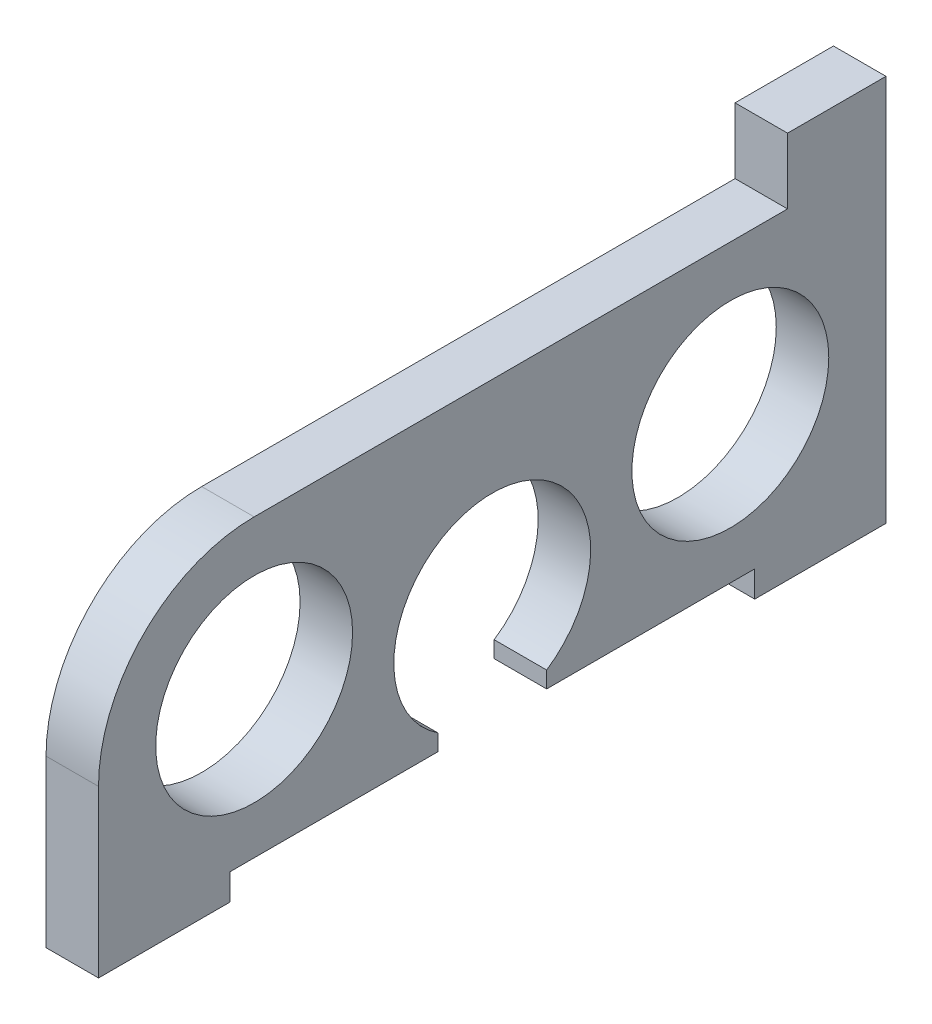
ISO-10303-21;
HEADER;
FILE_DESCRIPTION(('STEP AP214'),'2;1');
FILE_NAME('part.step','',(''),(''),'','','');
FILE_SCHEMA(('AUTOMOTIVE_DESIGN { 1 0 10303 214 1 1 1 1 }'));
ENDSEC;
DATA;
#1=APPLICATION_CONTEXT('core data for automotive mechanical design processes');
#2=APPLICATION_PROTOCOL_DEFINITION('international standard','automotive_design',2000,#1);
#3=PRODUCT_CONTEXT('',#1,'mechanical');
#4=PRODUCT('Part','Part','',(#3));
#5=PRODUCT_RELATED_PRODUCT_CATEGORY('part','',(#4));
#6=PRODUCT_DEFINITION_FORMATION('','',#4);
#7=PRODUCT_DEFINITION_CONTEXT('part definition',#1,'design');
#8=PRODUCT_DEFINITION('design','',#6,#7);
#9=PRODUCT_DEFINITION_SHAPE('','',#8);
#10=(LENGTH_UNIT() NAMED_UNIT(*) SI_UNIT(.MILLI.,.METRE.));
#11=(NAMED_UNIT(*) PLANE_ANGLE_UNIT() SI_UNIT($,.RADIAN.));
#12=(NAMED_UNIT(*) SI_UNIT($,.STERADIAN.) SOLID_ANGLE_UNIT());
#13=UNCERTAINTY_MEASURE_WITH_UNIT(LENGTH_MEASURE(1.E-05),#10,'distance_accuracy_value','');
#14=(GEOMETRIC_REPRESENTATION_CONTEXT(3) GLOBAL_UNCERTAINTY_ASSIGNED_CONTEXT((#13)) GLOBAL_UNIT_ASSIGNED_CONTEXT((#10,
#11,#12)) REPRESENTATION_CONTEXT('',''));
#15=CARTESIAN_POINT('',(0.,0.,0.));
#16=DIRECTION('',(0.,0.,1.));
#17=DIRECTION('',(1.,0.,0.));
#18=AXIS2_PLACEMENT_3D('',#15,#16,#17);
#19=CARTESIAN_POINT('',(1.6,4.8,0.));
#20=DIRECTION('',(-1.,0.,0.));
#21=DIRECTION('',(0.,0.,1.));
#22=AXIS2_PLACEMENT_3D('',#19,#20,#21);
#23=PLANE('',#22);
#24=DIRECTION('',(0.,0.,-1.));
#25=VECTOR('',#24,1.);
#26=CARTESIAN_POINT('',(1.6,10.8,7.25654876645916));
#27=LINE('',#26,#25);
#28=CARTESIAN_POINT('',(1.6,10.8,7.25654876645916));
#29=VERTEX_POINT('',#28);
#30=CARTESIAN_POINT('',(1.6,10.8,-9.));
#31=VERTEX_POINT('',#30);
#32=EDGE_CURVE('E341',#29,#31,#27,.T.);
#33=ORIENTED_EDGE('',*,*,#32,.F.);
#34=CARTESIAN_POINT('',(1.6,6.05654876645916,7.25654876645916));
#35=DIRECTION('',(1.,0.,0.));
#36=DIRECTION('',(0.,0.,-1.));
#37=AXIS2_PLACEMENT_3D('',#34,#35,#36);
#38=CIRCLE('',#37,4.74345123354084);
#39=CARTESIAN_POINT('',(1.6,6.05654876645916,12.));
#40=VERTEX_POINT('',#39);
#41=EDGE_CURVE('E272',#29,#40,#38,.T.);
#42=ORIENTED_EDGE('',*,*,#41,.T.);
#43=DIRECTION('',(0.,1.,0.));
#44=VECTOR('',#43,1.);
#45=CARTESIAN_POINT('',(1.6,1.,12.));
#46=LINE('',#45,#44);
#47=CARTESIAN_POINT('',(1.6,1.,12.));
#48=VERTEX_POINT('',#47);
#49=EDGE_CURVE('E255',#48,#40,#46,.T.);
#50=ORIENTED_EDGE('',*,*,#49,.F.);
#51=DIRECTION('',(0.,0.,1.));
#52=VECTOR('',#51,1.);
#53=CARTESIAN_POINT('',(1.6,1.,8.));
#54=LINE('',#53,#52);
#55=CARTESIAN_POINT('',(1.6,1.,8.));
#56=VERTEX_POINT('',#55);
#57=EDGE_CURVE('E270',#56,#48,#54,.T.);
#58=ORIENTED_EDGE('',*,*,#57,.F.);
#59=DIRECTION('',(0.,-1.,0.));
#60=VECTOR('',#59,1.);
#61=CARTESIAN_POINT('',(1.6,1.8,8.));
#62=LINE('',#61,#60);
#63=CARTESIAN_POINT('',(1.6,1.8,8.));
#64=VERTEX_POINT('',#63);
#65=EDGE_CURVE('E277',#64,#56,#62,.T.);
#66=ORIENTED_EDGE('',*,*,#65,.F.);
#67=DIRECTION('',(0.,0.,1.));
#68=VECTOR('',#67,1.);
#69=CARTESIAN_POINT('',(1.6,1.8,1.6583123951777));
#70=LINE('',#69,#68);
#71=CARTESIAN_POINT('',(1.6,1.8,1.6583123951777));
#72=VERTEX_POINT('',#71);
#73=EDGE_CURVE('E280',#72,#64,#70,.T.);
#74=ORIENTED_EDGE('',*,*,#73,.F.);
#75=DIRECTION('',(0.,-1.,0.));
#76=VECTOR('',#75,1.);
#77=CARTESIAN_POINT('',(1.6,2.3,1.6583123951777));
#78=LINE('',#77,#76);
#79=CARTESIAN_POINT('',(1.6,2.3,1.6583123951777));
#80=VERTEX_POINT('',#79);
#81=EDGE_CURVE('E418',#80,#72,#78,.T.);
#82=ORIENTED_EDGE('',*,*,#81,.F.);
#83=CARTESIAN_POINT('',(1.6,4.8,0.));
#84=DIRECTION('',(-1.,0.,0.));
#85=DIRECTION('',(0.,0.,1.));
#86=AXIS2_PLACEMENT_3D('',#83,#84,#85);
#87=CIRCLE('',#86,3.);
#88=CARTESIAN_POINT('',(1.6,2.3,-1.6583123951777));
#89=VERTEX_POINT('',#88);
#90=EDGE_CURVE('E415',#80,#89,#87,.T.);
#91=ORIENTED_EDGE('',*,*,#90,.T.);
#92=DIRECTION('',(0.,-1.,0.));
#93=VECTOR('',#92,1.);
#94=CARTESIAN_POINT('',(1.6,2.3,-1.6583123951777));
#95=LINE('',#94,#93);
#96=CARTESIAN_POINT('',(1.6,1.8,-1.6583123951777));
#97=VERTEX_POINT('',#96);
#98=EDGE_CURVE('E412',#89,#97,#95,.T.);
#99=ORIENTED_EDGE('',*,*,#98,.T.);
#100=DIRECTION('',(0.,0.,1.));
#101=VECTOR('',#100,1.);
#102=CARTESIAN_POINT('',(1.6,1.8,-8.));
#103=LINE('',#102,#101);
#104=CARTESIAN_POINT('',(1.6,1.8,-8.));
#105=VERTEX_POINT('',#104);
#106=EDGE_CURVE('E408',#105,#97,#103,.T.);
#107=ORIENTED_EDGE('',*,*,#106,.F.);
#108=DIRECTION('',(0.,1.,0.));
#109=VECTOR('',#108,1.);
#110=CARTESIAN_POINT('',(1.6,1.,-8.));
#111=LINE('',#110,#109);
#112=CARTESIAN_POINT('',(1.6,1.,-8.));
#113=VERTEX_POINT('',#112);
#114=EDGE_CURVE('E404',#113,#105,#111,.T.);
#115=ORIENTED_EDGE('',*,*,#114,.F.);
#116=DIRECTION('',(0.,0.,1.));
#117=VECTOR('',#116,1.);
#118=CARTESIAN_POINT('',(1.6,1.,-12.));
#119=LINE('',#118,#117);
#120=CARTESIAN_POINT('',(1.6,1.,-12.));
#121=VERTEX_POINT('',#120);
#122=EDGE_CURVE('E400',#121,#113,#119,.T.);
#123=ORIENTED_EDGE('',*,*,#122,.F.);
#124=DIRECTION('',(0.,1.,0.));
#125=VECTOR('',#124,1.);
#126=CARTESIAN_POINT('',(1.6,1.,-12.));
#127=LINE('',#126,#125);
#128=CARTESIAN_POINT('',(1.6,12.8,-12.));
#129=VERTEX_POINT('',#128);
#130=EDGE_CURVE('E397',#121,#129,#127,.T.);
#131=ORIENTED_EDGE('',*,*,#130,.T.);
#132=DIRECTION('',(0.,0.,-1.));
#133=VECTOR('',#132,1.);
#134=CARTESIAN_POINT('',(1.6,12.8,-9.));
#135=LINE('',#134,#133);
#136=CARTESIAN_POINT('',(1.6,12.8,-9.));
#137=VERTEX_POINT('',#136);
#138=EDGE_CURVE('E388',#137,#129,#135,.T.);
#139=ORIENTED_EDGE('',*,*,#138,.F.);
#140=DIRECTION('',(0.,1.,0.));
#141=VECTOR('',#140,1.);
#142=CARTESIAN_POINT('',(1.6,10.8,-9.));
#143=LINE('',#142,#141);
#144=EDGE_CURVE('E384',#31,#137,#143,.T.);
#145=ORIENTED_EDGE('',*,*,#144,.F.);
#146=EDGE_LOOP('',(#33,#42,#50,#58,#66,#74,#82,#91,#99,#107,#115,#123,#131,#139,#145));
#147=FACE_BOUND('',#146,.T.);
#148=CARTESIAN_POINT('',(1.6,6.25,7.25654876645916));
#149=DIRECTION('',(1.,0.,0.));
#150=DIRECTION('',(0.,0.,-1.));
#151=AXIS2_PLACEMENT_3D('',#148,#149,#150);
#152=CIRCLE('',#151,3.);
#153=CARTESIAN_POINT('',(1.6,6.25,4.25654876645916));
#154=VERTEX_POINT('',#153);
#155=EDGE_CURVE('E291',#154,#154,#152,.T.);
#156=ORIENTED_EDGE('',*,*,#155,.F.);
#157=EDGE_LOOP('',(#156));
#158=FACE_BOUND('',#157,.T.);
#159=CARTESIAN_POINT('',(1.6,6.25,-7.25654876645916));
#160=DIRECTION('',(1.,0.,0.));
#161=DIRECTION('',(0.,0.,-1.));
#162=AXIS2_PLACEMENT_3D('',#159,#160,#161);
#163=CIRCLE('',#162,3.);
#164=CARTESIAN_POINT('',(1.6,6.25,-10.2565487664592));
#165=VERTEX_POINT('',#164);
#166=EDGE_CURVE('E659',#165,#165,#163,.T.);
#167=ORIENTED_EDGE('',*,*,#166,.F.);
#168=EDGE_LOOP('',(#167));
#169=FACE_BOUND('',#168,.T.);
#170=ADVANCED_FACE('F139',(#147,#158,#169),#23,.F.);
#171=CARTESIAN_POINT('',(0.,4.8,0.));
#172=DIRECTION('',(-1.,0.,0.));
#173=DIRECTION('',(0.,0.,1.));
#174=AXIS2_PLACEMENT_3D('',#171,#172,#173);
#175=PLANE('',#174);
#176=CARTESIAN_POINT('',(0.,6.25,7.25654876645916));
#177=DIRECTION('',(1.,0.,0.));
#178=DIRECTION('',(0.,0.,-1.));
#179=AXIS2_PLACEMENT_3D('',#176,#177,#178);
#180=CIRCLE('',#179,3.);
#181=CARTESIAN_POINT('',(0.,6.25,4.25654876645916));
#182=VERTEX_POINT('',#181);
#183=EDGE_CURVE('E391',#182,#182,#180,.T.);
#184=ORIENTED_EDGE('',*,*,#183,.T.);
#185=EDGE_LOOP('',(#184));
#186=FACE_BOUND('',#185,.T.);
#187=DIRECTION('',(0.,0.,-1.));
#188=VECTOR('',#187,1.);
#189=CARTESIAN_POINT('',(0.,10.8,7.25654876645916));
#190=LINE('',#189,#188);
#191=CARTESIAN_POINT('',(0.,10.8,7.25654876645916));
#192=VERTEX_POINT('',#191);
#193=CARTESIAN_POINT('',(0.,10.8,-9.));
#194=VERTEX_POINT('',#193);
#195=EDGE_CURVE('E286',#192,#194,#190,.T.);
#196=ORIENTED_EDGE('',*,*,#195,.T.);
#197=DIRECTION('',(0.,1.,0.));
#198=VECTOR('',#197,1.);
#199=CARTESIAN_POINT('',(0.,10.8,-9.));
#200=LINE('',#199,#198);
#201=CARTESIAN_POINT('',(0.,12.8,-9.));
#202=VERTEX_POINT('',#201);
#203=EDGE_CURVE('E290',#194,#202,#200,.T.);
#204=ORIENTED_EDGE('',*,*,#203,.T.);
#205=DIRECTION('',(0.,0.,-1.));
#206=VECTOR('',#205,1.);
#207=CARTESIAN_POINT('',(0.,12.8,-9.));
#208=LINE('',#207,#206);
#209=CARTESIAN_POINT('',(0.,12.8,-12.));
#210=VERTEX_POINT('',#209);
#211=EDGE_CURVE('E295',#202,#210,#208,.T.);
#212=ORIENTED_EDGE('',*,*,#211,.T.);
#213=DIRECTION('',(0.,1.,0.));
#214=VECTOR('',#213,1.);
#215=CARTESIAN_POINT('',(0.,1.,-12.));
#216=LINE('',#215,#214);
#217=CARTESIAN_POINT('',(0.,1.,-12.));
#218=VERTEX_POINT('',#217);
#219=EDGE_CURVE('E299',#218,#210,#216,.T.);
#220=ORIENTED_EDGE('',*,*,#219,.F.);
#221=DIRECTION('',(0.,0.,1.));
#222=VECTOR('',#221,1.);
#223=CARTESIAN_POINT('',(0.,1.,-12.));
#224=LINE('',#223,#222);
#225=CARTESIAN_POINT('',(0.,1.,-8.));
#226=VERTEX_POINT('',#225);
#227=EDGE_CURVE('E303',#218,#226,#224,.T.);
#228=ORIENTED_EDGE('',*,*,#227,.T.);
#229=DIRECTION('',(0.,1.,0.));
#230=VECTOR('',#229,1.);
#231=CARTESIAN_POINT('',(0.,1.,-8.));
#232=LINE('',#231,#230);
#233=CARTESIAN_POINT('',(0.,1.8,-8.));
#234=VERTEX_POINT('',#233);
#235=EDGE_CURVE('E307',#226,#234,#232,.T.);
#236=ORIENTED_EDGE('',*,*,#235,.T.);
#237=DIRECTION('',(0.,0.,1.));
#238=VECTOR('',#237,1.);
#239=CARTESIAN_POINT('',(0.,1.8,-8.));
#240=LINE('',#239,#238);
#241=CARTESIAN_POINT('',(0.,1.8,-1.6583123951777));
#242=VERTEX_POINT('',#241);
#243=EDGE_CURVE('E311',#234,#242,#240,.T.);
#244=ORIENTED_EDGE('',*,*,#243,.T.);
#245=DIRECTION('',(0.,-1.,0.));
#246=VECTOR('',#245,1.);
#247=CARTESIAN_POINT('',(0.,2.3,-1.6583123951777));
#248=LINE('',#247,#246);
#249=CARTESIAN_POINT('',(0.,2.3,-1.6583123951777));
#250=VERTEX_POINT('',#249);
#251=EDGE_CURVE('E315',#250,#242,#248,.T.);
#252=ORIENTED_EDGE('',*,*,#251,.F.);
#253=CARTESIAN_POINT('',(0.,4.8,0.));
#254=DIRECTION('',(-1.,0.,0.));
#255=DIRECTION('',(0.,0.,1.));
#256=AXIS2_PLACEMENT_3D('',#253,#254,#255);
#257=CIRCLE('',#256,3.);
#258=CARTESIAN_POINT('',(0.,2.3,1.6583123951777));
#259=VERTEX_POINT('',#258);
#260=EDGE_CURVE('E319',#259,#250,#257,.T.);
#261=ORIENTED_EDGE('',*,*,#260,.F.);
#262=DIRECTION('',(0.,-1.,0.));
#263=VECTOR('',#262,1.);
#264=CARTESIAN_POINT('',(0.,2.3,1.6583123951777));
#265=LINE('',#264,#263);
#266=CARTESIAN_POINT('',(0.,1.8,1.6583123951777));
#267=VERTEX_POINT('',#266);
#268=EDGE_CURVE('E322',#259,#267,#265,.T.);
#269=ORIENTED_EDGE('',*,*,#268,.T.);
#270=DIRECTION('',(0.,0.,1.));
#271=VECTOR('',#270,1.);
#272=CARTESIAN_POINT('',(0.,1.8,1.6583123951777));
#273=LINE('',#272,#271);
#274=CARTESIAN_POINT('',(0.,1.8,8.));
#275=VERTEX_POINT('',#274);
#276=EDGE_CURVE('E326',#267,#275,#273,.T.);
#277=ORIENTED_EDGE('',*,*,#276,.T.);
#278=DIRECTION('',(0.,-1.,0.));
#279=VECTOR('',#278,1.);
#280=CARTESIAN_POINT('',(0.,1.8,8.));
#281=LINE('',#280,#279);
#282=CARTESIAN_POINT('',(0.,1.,8.));
#283=VERTEX_POINT('',#282);
#284=EDGE_CURVE('E330',#275,#283,#281,.T.);
#285=ORIENTED_EDGE('',*,*,#284,.T.);
#286=DIRECTION('',(0.,0.,1.));
#287=VECTOR('',#286,1.);
#288=CARTESIAN_POINT('',(0.,1.,8.));
#289=LINE('',#288,#287);
#290=CARTESIAN_POINT('',(0.,1.,12.));
#291=VERTEX_POINT('',#290);
#292=EDGE_CURVE('E334',#283,#291,#289,.T.);
#293=ORIENTED_EDGE('',*,*,#292,.T.);
#294=DIRECTION('',(0.,1.,0.));
#295=VECTOR('',#294,1.);
#296=CARTESIAN_POINT('',(0.,1.,12.));
#297=LINE('',#296,#295);
#298=CARTESIAN_POINT('',(0.,6.05654876645916,12.));
#299=VERTEX_POINT('',#298);
#300=EDGE_CURVE('E257',#291,#299,#297,.T.);
#301=ORIENTED_EDGE('',*,*,#300,.T.);
#302=CARTESIAN_POINT('',(0.,6.05654876645916,7.25654876645916));
#303=DIRECTION('',(1.,0.,0.));
#304=DIRECTION('',(0.,0.,-1.));
#305=AXIS2_PLACEMENT_3D('',#302,#303,#304);
#306=CIRCLE('',#305,4.74345123354084);
#307=EDGE_CURVE('E339',#192,#299,#306,.T.);
#308=ORIENTED_EDGE('',*,*,#307,.F.);
#309=EDGE_LOOP('',(#196,#204,#212,#220,#228,#236,#244,#252,#261,#269,#277,#285,#293,#301,#308));
#310=FACE_BOUND('',#309,.T.);
#311=CARTESIAN_POINT('',(0.,6.25,-7.25654876645916));
#312=DIRECTION('',(1.,0.,0.));
#313=DIRECTION('',(0.,0.,-1.));
#314=AXIS2_PLACEMENT_3D('',#311,#312,#313);
#315=CIRCLE('',#314,3.);
#316=CARTESIAN_POINT('',(0.,6.25,-10.2565487664592));
#317=VERTEX_POINT('',#316);
#318=EDGE_CURVE('E662',#317,#317,#315,.T.);
#319=ORIENTED_EDGE('',*,*,#318,.T.);
#320=EDGE_LOOP('',(#319));
#321=FACE_BOUND('',#320,.T.);
#322=ADVANCED_FACE('F380',(#186,#310,#321),#175,.T.);
#323=CARTESIAN_POINT('',(1.6,10.8,7.25654876645916));
#324=DIRECTION('',(0.,1.,0.));
#325=DIRECTION('',(0.,0.,1.));
#326=AXIS2_PLACEMENT_3D('',#323,#324,#325);
#327=PLANE('',#326);
#328=ORIENTED_EDGE('',*,*,#195,.F.);
#329=DIRECTION('',(-1.,0.,0.));
#330=VECTOR('',#329,1.);
#331=CARTESIAN_POINT('',(1.6,10.8,7.25654876645916));
#332=LINE('',#331,#330);
#333=EDGE_CURVE('E12',#29,#192,#332,.T.);
#334=ORIENTED_EDGE('',*,*,#333,.F.);
#335=ORIENTED_EDGE('',*,*,#32,.T.);
#336=DIRECTION('',(-1.,0.,0.));
#337=VECTOR('',#336,1.);
#338=CARTESIAN_POINT('',(1.6,10.8,-9.));
#339=LINE('',#338,#337);
#340=EDGE_CURVE('E143',#31,#194,#339,.T.);
#341=ORIENTED_EDGE('',*,*,#340,.T.);
#342=EDGE_LOOP('',(#328,#334,#335,#341));
#343=FACE_BOUND('',#342,.T.);
#344=ADVANCED_FACE('F141',(#343),#327,.T.);
#345=CARTESIAN_POINT('',(1.6,6.05654876645916,7.25654876645916));
#346=DIRECTION('',(-1.,0.,0.));
#347=DIRECTION('',(0.,0.,1.));
#348=AXIS2_PLACEMENT_3D('',#345,#346,#347);
#349=CYLINDRICAL_SURFACE('',#348,4.74345123354084);
#350=ORIENTED_EDGE('',*,*,#307,.T.);
#351=DIRECTION('',(-1.,0.,0.));
#352=VECTOR('',#351,1.);
#353=CARTESIAN_POINT('',(1.6,6.05654876645916,12.));
#354=LINE('',#353,#352);
#355=EDGE_CURVE('E150',#40,#299,#354,.T.);
#356=ORIENTED_EDGE('',*,*,#355,.F.);
#357=ORIENTED_EDGE('',*,*,#41,.F.);
#358=ORIENTED_EDGE('',*,*,#333,.T.);
#359=EDGE_LOOP('',(#350,#356,#357,#358));
#360=FACE_BOUND('',#359,.T.);
#361=ADVANCED_FACE('F382',(#360),#349,.T.);
#362=CARTESIAN_POINT('',(1.6,1.,12.));
#363=DIRECTION('',(0.,0.,1.));
#364=DIRECTION('',(1.,0.,0.));
#365=AXIS2_PLACEMENT_3D('',#362,#363,#364);
#366=PLANE('',#365);
#367=ORIENTED_EDGE('',*,*,#300,.F.);
#368=DIRECTION('',(-1.,0.,0.));
#369=VECTOR('',#368,1.);
#370=CARTESIAN_POINT('',(1.6,1.,12.));
#371=LINE('',#370,#369);
#372=EDGE_CURVE('E252',#48,#291,#371,.T.);
#373=ORIENTED_EDGE('',*,*,#372,.F.);
#374=ORIENTED_EDGE('',*,*,#49,.T.);
#375=ORIENTED_EDGE('',*,*,#355,.T.);
#376=EDGE_LOOP('',(#367,#373,#374,#375));
#377=FACE_BOUND('',#376,.T.);
#378=ADVANCED_FACE('F254',(#377),#366,.T.);
#379=CARTESIAN_POINT('',(1.6,1.,8.));
#380=DIRECTION('',(0.,-1.,0.));
#381=DIRECTION('',(0.,0.,-1.));
#382=AXIS2_PLACEMENT_3D('',#379,#380,#381);
#383=PLANE('',#382);
#384=ORIENTED_EDGE('',*,*,#292,.F.);
#385=DIRECTION('',(-1.,0.,0.));
#386=VECTOR('',#385,1.);
#387=CARTESIAN_POINT('',(1.6,1.,8.));
#388=LINE('',#387,#386);
#389=EDGE_CURVE('E263',#56,#283,#388,.T.);
#390=ORIENTED_EDGE('',*,*,#389,.F.);
#391=ORIENTED_EDGE('',*,*,#57,.T.);
#392=ORIENTED_EDGE('',*,*,#372,.T.);
#393=EDGE_LOOP('',(#384,#390,#391,#392));
#394=FACE_BOUND('',#393,.T.);
#395=ADVANCED_FACE('F275',(#394),#383,.T.);
#396=CARTESIAN_POINT('',(1.6,1.8,8.));
#397=DIRECTION('',(0.,0.,-1.));
#398=DIRECTION('',(-1.,0.,0.));
#399=AXIS2_PLACEMENT_3D('',#396,#397,#398);
#400=PLANE('',#399);
#401=ORIENTED_EDGE('',*,*,#284,.F.);
#402=DIRECTION('',(-1.,0.,0.));
#403=VECTOR('',#402,1.);
#404=CARTESIAN_POINT('',(1.6,1.8,8.));
#405=LINE('',#404,#403);
#406=EDGE_CURVE('E347',#64,#275,#405,.T.);
#407=ORIENTED_EDGE('',*,*,#406,.F.);
#408=ORIENTED_EDGE('',*,*,#65,.T.);
#409=ORIENTED_EDGE('',*,*,#389,.T.);
#410=EDGE_LOOP('',(#401,#407,#408,#409));
#411=FACE_BOUND('',#410,.T.);
#412=ADVANCED_FACE('F462',(#411),#400,.T.);
#413=CARTESIAN_POINT('',(1.6,1.8,1.6583123951777));
#414=DIRECTION('',(0.,-1.,0.));
#415=DIRECTION('',(0.,0.,-1.));
#416=AXIS2_PLACEMENT_3D('',#413,#414,#415);
#417=PLANE('',#416);
#418=ORIENTED_EDGE('',*,*,#276,.F.);
#419=DIRECTION('',(-1.,0.,0.));
#420=VECTOR('',#419,1.);
#421=CARTESIAN_POINT('',(1.6,1.8,1.6583123951777));
#422=LINE('',#421,#420);
#423=EDGE_CURVE('E350',#72,#267,#422,.T.);
#424=ORIENTED_EDGE('',*,*,#423,.F.);
#425=ORIENTED_EDGE('',*,*,#73,.T.);
#426=ORIENTED_EDGE('',*,*,#406,.T.);
#427=EDGE_LOOP('',(#418,#424,#425,#426));
#428=FACE_BOUND('',#427,.T.);
#429=ADVANCED_FACE('F426',(#428),#417,.T.);
#430=CARTESIAN_POINT('',(1.6,2.3,1.6583123951777));
#431=DIRECTION('',(0.,0.,-1.));
#432=DIRECTION('',(-1.,0.,0.));
#433=AXIS2_PLACEMENT_3D('',#430,#431,#432);
#434=PLANE('',#433);
#435=ORIENTED_EDGE('',*,*,#268,.F.);
#436=DIRECTION('',(-1.,0.,0.));
#437=VECTOR('',#436,1.);
#438=CARTESIAN_POINT('',(1.6,2.3,1.6583123951777));
#439=LINE('',#438,#437);
#440=EDGE_CURVE('E353',#80,#259,#439,.T.);
#441=ORIENTED_EDGE('',*,*,#440,.F.);
#442=ORIENTED_EDGE('',*,*,#81,.T.);
#443=ORIENTED_EDGE('',*,*,#423,.T.);
#444=EDGE_LOOP('',(#435,#441,#442,#443));
#445=FACE_BOUND('',#444,.T.);
#446=ADVANCED_FACE('F431',(#445),#434,.T.);
#447=CARTESIAN_POINT('',(1.6,4.8,0.));
#448=DIRECTION('',(-1.,0.,0.));
#449=DIRECTION('',(0.,0.,1.));
#450=AXIS2_PLACEMENT_3D('',#447,#448,#449);
#451=CYLINDRICAL_SURFACE('',#450,3.);
#452=ORIENTED_EDGE('',*,*,#260,.T.);
#453=DIRECTION('',(-1.,0.,0.));
#454=VECTOR('',#453,1.);
#455=CARTESIAN_POINT('',(1.6,2.3,-1.6583123951777));
#456=LINE('',#455,#454);
#457=EDGE_CURVE('E356',#89,#250,#456,.T.);
#458=ORIENTED_EDGE('',*,*,#457,.F.);
#459=ORIENTED_EDGE('',*,*,#90,.F.);
#460=ORIENTED_EDGE('',*,*,#440,.T.);
#461=EDGE_LOOP('',(#452,#458,#459,#460));
#462=FACE_BOUND('',#461,.T.);
#463=ADVANCED_FACE('F436',(#462),#451,.F.);
#464=CARTESIAN_POINT('',(1.6,2.3,-1.6583123951777));
#465=DIRECTION('',(0.,0.,-1.));
#466=DIRECTION('',(-1.,0.,0.));
#467=AXIS2_PLACEMENT_3D('',#464,#465,#466);
#468=PLANE('',#467);
#469=ORIENTED_EDGE('',*,*,#251,.T.);
#470=DIRECTION('',(-1.,0.,0.));
#471=VECTOR('',#470,1.);
#472=CARTESIAN_POINT('',(1.6,1.8,-1.6583123951777));
#473=LINE('',#472,#471);
#474=EDGE_CURVE('E360',#97,#242,#473,.T.);
#475=ORIENTED_EDGE('',*,*,#474,.F.);
#476=ORIENTED_EDGE('',*,*,#98,.F.);
#477=ORIENTED_EDGE('',*,*,#457,.T.);
#478=EDGE_LOOP('',(#469,#475,#476,#477));
#479=FACE_BOUND('',#478,.T.);
#480=ADVANCED_FACE('F442',(#479),#468,.F.);
#481=CARTESIAN_POINT('',(1.6,1.8,-8.));
#482=DIRECTION('',(0.,-1.,0.));
#483=DIRECTION('',(0.,0.,-1.));
#484=AXIS2_PLACEMENT_3D('',#481,#482,#483);
#485=PLANE('',#484);
#486=ORIENTED_EDGE('',*,*,#243,.F.);
#487=DIRECTION('',(-1.,0.,0.));
#488=VECTOR('',#487,1.);
#489=CARTESIAN_POINT('',(1.6,1.8,-8.));
#490=LINE('',#489,#488);
#491=EDGE_CURVE('E363',#105,#234,#490,.T.);
#492=ORIENTED_EDGE('',*,*,#491,.F.);
#493=ORIENTED_EDGE('',*,*,#106,.T.);
#494=ORIENTED_EDGE('',*,*,#474,.T.);
#495=EDGE_LOOP('',(#486,#492,#493,#494));
#496=FACE_BOUND('',#495,.T.);
#497=ADVANCED_FACE('F446',(#496),#485,.T.);
#498=CARTESIAN_POINT('',(1.6,1.,-8.));
#499=DIRECTION('',(0.,0.,1.));
#500=DIRECTION('',(0.,-1.,0.));
#501=AXIS2_PLACEMENT_3D('',#498,#499,#500);
#502=PLANE('',#501);
#503=ORIENTED_EDGE('',*,*,#235,.F.);
#504=DIRECTION('',(-1.,0.,0.));
#505=VECTOR('',#504,1.);
#506=CARTESIAN_POINT('',(1.6,1.,-8.));
#507=LINE('',#506,#505);
#508=EDGE_CURVE('E366',#113,#226,#507,.T.);
#509=ORIENTED_EDGE('',*,*,#508,.F.);
#510=ORIENTED_EDGE('',*,*,#114,.T.);
#511=ORIENTED_EDGE('',*,*,#491,.T.);
#512=EDGE_LOOP('',(#503,#509,#510,#511));
#513=FACE_BOUND('',#512,.T.);
#514=ADVANCED_FACE('F449',(#513),#502,.T.);
#515=CARTESIAN_POINT('',(1.6,1.,-12.));
#516=DIRECTION('',(0.,-1.,0.));
#517=DIRECTION('',(0.,0.,-1.));
#518=AXIS2_PLACEMENT_3D('',#515,#516,#517);
#519=PLANE('',#518);
#520=ORIENTED_EDGE('',*,*,#227,.F.);
#521=DIRECTION('',(-1.,0.,0.));
#522=VECTOR('',#521,1.);
#523=CARTESIAN_POINT('',(1.6,1.,-12.));
#524=LINE('',#523,#522);
#525=EDGE_CURVE('E369',#121,#218,#524,.T.);
#526=ORIENTED_EDGE('',*,*,#525,.F.);
#527=ORIENTED_EDGE('',*,*,#122,.T.);
#528=ORIENTED_EDGE('',*,*,#508,.T.);
#529=EDGE_LOOP('',(#520,#526,#527,#528));
#530=FACE_BOUND('',#529,.T.);
#531=ADVANCED_FACE('F453',(#530),#519,.T.);
#532=CARTESIAN_POINT('',(1.6,1.,-12.));
#533=DIRECTION('',(0.,0.,1.));
#534=DIRECTION('',(1.,0.,0.));
#535=AXIS2_PLACEMENT_3D('',#532,#533,#534);
#536=PLANE('',#535);
#537=ORIENTED_EDGE('',*,*,#219,.T.);
#538=DIRECTION('',(-1.,0.,0.));
#539=VECTOR('',#538,1.);
#540=CARTESIAN_POINT('',(1.6,12.8,-12.));
#541=LINE('',#540,#539);
#542=EDGE_CURVE('E372',#129,#210,#541,.T.);
#543=ORIENTED_EDGE('',*,*,#542,.F.);
#544=ORIENTED_EDGE('',*,*,#130,.F.);
#545=ORIENTED_EDGE('',*,*,#525,.T.);
#546=EDGE_LOOP('',(#537,#543,#544,#545));
#547=FACE_BOUND('',#546,.T.);
#548=ADVANCED_FACE('F458',(#547),#536,.F.);
#549=CARTESIAN_POINT('',(1.6,12.8,-9.));
#550=DIRECTION('',(0.,1.,0.));
#551=DIRECTION('',(0.,0.,1.));
#552=AXIS2_PLACEMENT_3D('',#549,#550,#551);
#553=PLANE('',#552);
#554=ORIENTED_EDGE('',*,*,#211,.F.);
#555=DIRECTION('',(-1.,0.,0.));
#556=VECTOR('',#555,1.);
#557=CARTESIAN_POINT('',(1.6,12.8,-9.));
#558=LINE('',#557,#556);
#559=EDGE_CURVE('E374',#137,#202,#558,.T.);
#560=ORIENTED_EDGE('',*,*,#559,.F.);
#561=ORIENTED_EDGE('',*,*,#138,.T.);
#562=ORIENTED_EDGE('',*,*,#542,.T.);
#563=EDGE_LOOP('',(#554,#560,#561,#562));
#564=FACE_BOUND('',#563,.T.);
#565=ADVANCED_FACE('F460',(#564),#553,.T.);
#566=CARTESIAN_POINT('',(1.6,10.8,-9.));
#567=DIRECTION('',(0.,0.,1.));
#568=DIRECTION('',(1.,0.,0.));
#569=AXIS2_PLACEMENT_3D('',#566,#567,#568);
#570=PLANE('',#569);
#571=ORIENTED_EDGE('',*,*,#203,.F.);
#572=ORIENTED_EDGE('',*,*,#340,.F.);
#573=ORIENTED_EDGE('',*,*,#144,.T.);
#574=ORIENTED_EDGE('',*,*,#559,.T.);
#575=EDGE_LOOP('',(#571,#572,#573,#574));
#576=FACE_BOUND('',#575,.T.);
#577=ADVANCED_FACE('F378',(#576),#570,.T.);
#578=CARTESIAN_POINT('',(1.6,6.25,7.25654876645916));
#579=DIRECTION('',(-1.,0.,0.));
#580=DIRECTION('',(0.,0.,1.));
#581=AXIS2_PLACEMENT_3D('',#578,#579,#580);
#582=CYLINDRICAL_SURFACE('',#581,3.);
#583=ORIENTED_EDGE('',*,*,#155,.T.);
#584=EDGE_LOOP('',(#583));
#585=FACE_BOUND('',#584,.T.);
#586=ORIENTED_EDGE('',*,*,#183,.F.);
#587=EDGE_LOOP('',(#586));
#588=FACE_BOUND('',#587,.T.);
#589=ADVANCED_FACE('F479',(#585,#588),#582,.F.);
#590=CARTESIAN_POINT('',(1.6,6.25,-7.25654876645916));
#591=DIRECTION('',(-1.,0.,0.));
#592=DIRECTION('',(0.,0.,1.));
#593=AXIS2_PLACEMENT_3D('',#590,#591,#592);
#594=CYLINDRICAL_SURFACE('',#593,3.);
#595=ORIENTED_EDGE('',*,*,#166,.T.);
#596=EDGE_LOOP('',(#595));
#597=FACE_BOUND('',#596,.T.);
#598=ORIENTED_EDGE('',*,*,#318,.F.);
#599=EDGE_LOOP('',(#598));
#600=FACE_BOUND('',#599,.T.);
#601=ADVANCED_FACE('F596',(#597,#600),#594,.F.);
#602=CLOSED_SHELL('',(#170,#322,#344,#361,#378,#395,#412,#429,#446,#463,#480,#497,#514,#531,
#548,#565,#577,#589,#601));
#603=MANIFOLD_SOLID_BREP('B2',#602);
#604=ADVANCED_BREP_SHAPE_REPRESENTATION('',(#18,#603),#14);
#605=SHAPE_DEFINITION_REPRESENTATION(#9,#604);
ENDSEC;
END-ISO-10303-21;
